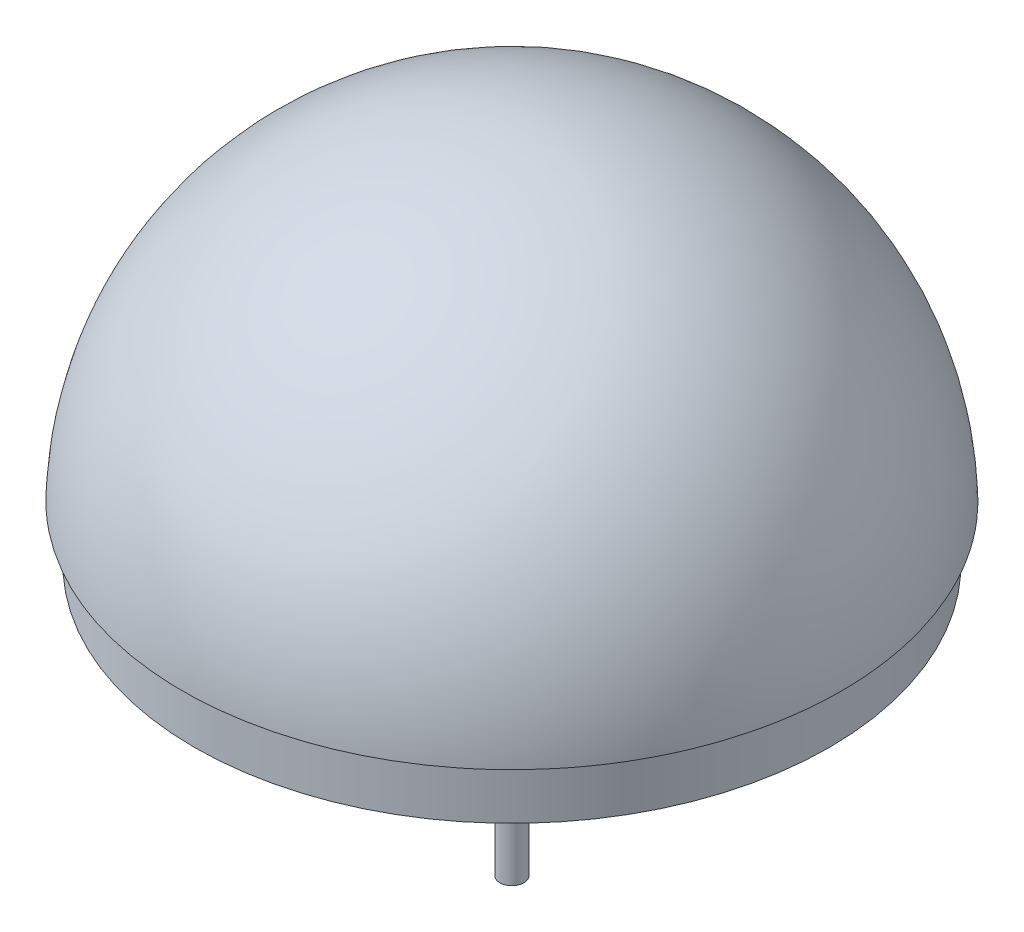
ISO-10303-21;
HEADER;
FILE_DESCRIPTION(('STEP AP214'),'2;1');
FILE_NAME('part.step','',(''),(''),'','','');
FILE_SCHEMA(('AUTOMOTIVE_DESIGN { 1 0 10303 214 1 1 1 1 }'));
ENDSEC;
DATA;
#1=APPLICATION_CONTEXT('core data for automotive mechanical design processes');
#2=APPLICATION_PROTOCOL_DEFINITION('international standard','automotive_design',2000,#1);
#3=PRODUCT_CONTEXT('',#1,'mechanical');
#4=PRODUCT('Part','Part','',(#3));
#5=PRODUCT_RELATED_PRODUCT_CATEGORY('part','',(#4));
#6=PRODUCT_DEFINITION_FORMATION('','',#4);
#7=PRODUCT_DEFINITION_CONTEXT('part definition',#1,'design');
#8=PRODUCT_DEFINITION('design','',#6,#7);
#9=PRODUCT_DEFINITION_SHAPE('','',#8);
#10=(LENGTH_UNIT() NAMED_UNIT(*) SI_UNIT(.MILLI.,.METRE.));
#11=(NAMED_UNIT(*) PLANE_ANGLE_UNIT() SI_UNIT($,.RADIAN.));
#12=(NAMED_UNIT(*) SI_UNIT($,.STERADIAN.) SOLID_ANGLE_UNIT());
#13=UNCERTAINTY_MEASURE_WITH_UNIT(LENGTH_MEASURE(1.E-05),#10,'distance_accuracy_value','');
#14=(GEOMETRIC_REPRESENTATION_CONTEXT(3) GLOBAL_UNCERTAINTY_ASSIGNED_CONTEXT((#13)) GLOBAL_UNIT_ASSIGNED_CONTEXT((#10,
#11,#12)) REPRESENTATION_CONTEXT('',''));
#15=CARTESIAN_POINT('',(0.,0.,0.));
#16=DIRECTION('',(0.,0.,1.));
#17=DIRECTION('',(1.,0.,0.));
#18=AXIS2_PLACEMENT_3D('',#15,#16,#17);
#19=CARTESIAN_POINT('',(0.,0.,0.));
#20=DIRECTION('',(-1.,0.,0.));
#21=DIRECTION('',(0.,1.,0.));
#22=AXIS2_PLACEMENT_3D('',#19,#20,#21);
#23=SPHERICAL_SURFACE('',#22,39.0404692850893);
#24=CARTESIAN_POINT('',(0.,-39.011696195372,0.));
#25=DIRECTION('',(0.,-1.,0.));
#26=DIRECTION('',(0.,0.,-1.));
#27=AXIS2_PLACEMENT_3D('',#24,#25,#26);
#28=CIRCLE('',#27,1.49860000000001);
#29=CARTESIAN_POINT('',(0.,-39.011696195372,-1.49860000000001));
#30=VERTEX_POINT('',#29);
#31=EDGE_CURVE('E19',#30,#30,#28,.F.);
#32=ORIENTED_EDGE('',*,*,#31,.F.);
#33=EDGE_LOOP('',(#32));
#34=FACE_BOUND('',#33,.T.);
#35=ADVANCED_FACE('F15',(#34),#23,.T.);
#36=CARTESIAN_POINT('',(0.,0.,0.));
#37=DIRECTION('',(0.,-1.,0.));
#38=DIRECTION('',(0.,0.,-1.));
#39=AXIS2_PLACEMENT_3D('',#36,#37,#38);
#40=CYLINDRICAL_SURFACE('',#39,1.49860000000001);
#41=CARTESIAN_POINT('',(0.,39.011696195372,0.));
#42=DIRECTION('',(0.,-1.,0.));
#43=DIRECTION('',(0.,0.,-1.));
#44=AXIS2_PLACEMENT_3D('',#41,#42,#43);
#45=CIRCLE('',#44,1.49860000000001);
#46=CARTESIAN_POINT('',(0.,39.011696195372,-1.49860000000001));
#47=VERTEX_POINT('',#46);
#48=EDGE_CURVE('E64',#47,#47,#45,.T.);
#49=ORIENTED_EDGE('',*,*,#48,.T.);
#50=EDGE_LOOP('',(#49));
#51=FACE_BOUND('',#50,.T.);
#52=ORIENTED_EDGE('',*,*,#31,.T.);
#53=EDGE_LOOP('',(#52));
#54=FACE_BOUND('',#53,.T.);
#55=ADVANCED_FACE('F51',(#51,#54),#40,.T.);
#56=CARTESIAN_POINT('',(0.,0.,0.));
#57=DIRECTION('',(1.,0.,0.));
#58=DIRECTION('',(0.,1.,0.));
#59=AXIS2_PLACEMENT_3D('',#56,#57,#58);
#60=SPHERICAL_SURFACE('',#59,39.0404692850893);
#61=ORIENTED_EDGE('',*,*,#48,.F.);
#62=EDGE_LOOP('',(#61));
#63=FACE_BOUND('',#62,.T.);
#64=CARTESIAN_POINT('',(0.,11.1506,0.));
#65=DIRECTION('',(0.,-1.,0.));
#66=DIRECTION('',(0.,0.,-1.));
#67=AXIS2_PLACEMENT_3D('',#64,#65,#66);
#68=CIRCLE('',#67,37.4142);
#69=CARTESIAN_POINT('',(0.,11.1506,-37.4142));
#70=VERTEX_POINT('',#69);
#71=EDGE_CURVE('E67',#70,#70,#68,.T.);
#72=ORIENTED_EDGE('',*,*,#71,.T.);
#73=EDGE_LOOP('',(#72));
#74=FACE_BOUND('',#73,.T.);
#75=ADVANCED_FACE('F47',(#63,#74),#60,.F.);
#76=CARTESIAN_POINT('',(0.,0.,0.));
#77=DIRECTION('',(0.,-1.,0.));
#78=DIRECTION('',(0.,0.,-1.));
#79=AXIS2_PLACEMENT_3D('',#76,#77,#78);
#80=CYLINDRICAL_SURFACE('',#79,37.4142);
#81=ORIENTED_EDGE('',*,*,#71,.F.);
#82=EDGE_LOOP('',(#81));
#83=FACE_BOUND('',#82,.T.);
#84=CARTESIAN_POINT('',(0.,-5.53720000000001,0.));
#85=DIRECTION('',(0.,-1.,0.));
#86=DIRECTION('',(0.,0.,-1.));
#87=AXIS2_PLACEMENT_3D('',#84,#85,#86);
#88=CIRCLE('',#87,37.4142);
#89=CARTESIAN_POINT('',(0.,-5.53720000000001,-37.4142));
#90=VERTEX_POINT('',#89);
#91=EDGE_CURVE('E69',#90,#90,#88,.T.);
#92=ORIENTED_EDGE('',*,*,#91,.T.);
#93=EDGE_LOOP('',(#92));
#94=FACE_BOUND('',#93,.T.);
#95=ADVANCED_FACE('F50',(#83,#94),#80,.F.);
#96=CARTESIAN_POINT('',(0.,-5.53720000000001,0.));
#97=DIRECTION('',(0.,1.,0.));
#98=DIRECTION('',(0.,0.,1.));
#99=AXIS2_PLACEMENT_3D('',#96,#97,#98);
#100=PLANE('',#99);
#101=CARTESIAN_POINT('',(0.,-5.53720000000001,0.));
#102=DIRECTION('',(0.,-1.,0.));
#103=DIRECTION('',(0.,0.,-1.));
#104=AXIS2_PLACEMENT_3D('',#101,#102,#103);
#105=CIRCLE('',#104,39.37);
#106=CARTESIAN_POINT('',(0.,-5.53720000000001,-39.37));
#107=VERTEX_POINT('',#106);
#108=EDGE_CURVE('E28',#107,#107,#105,.F.);
#109=ORIENTED_EDGE('',*,*,#108,.F.);
#110=EDGE_LOOP('',(#109));
#111=FACE_BOUND('',#110,.T.);
#112=ORIENTED_EDGE('',*,*,#91,.F.);
#113=EDGE_LOOP('',(#112));
#114=FACE_BOUND('',#113,.T.);
#115=ADVANCED_FACE('F79',(#111,#114),#100,.F.);
#116=CARTESIAN_POINT('',(0.,0.,0.));
#117=DIRECTION('',(0.,-1.,0.));
#118=DIRECTION('',(0.,0.,-1.));
#119=AXIS2_PLACEMENT_3D('',#116,#117,#118);
#120=CYLINDRICAL_SURFACE('',#119,39.37);
#121=ORIENTED_EDGE('',*,*,#108,.T.);
#122=EDGE_LOOP('',(#121));
#123=FACE_BOUND('',#122,.T.);
#124=CARTESIAN_POINT('',(0.,1.26999999999999,0.));
#125=DIRECTION('',(0.,-1.,0.));
#126=DIRECTION('',(0.,0.,-1.));
#127=AXIS2_PLACEMENT_3D('',#124,#125,#126);
#128=CIRCLE('',#127,39.37);
#129=CARTESIAN_POINT('',(0.,1.26999999999999,-39.37));
#130=VERTEX_POINT('',#129);
#131=EDGE_CURVE('E23',#130,#130,#128,.T.);
#132=ORIENTED_EDGE('',*,*,#131,.T.);
#133=EDGE_LOOP('',(#132));
#134=FACE_BOUND('',#133,.T.);
#135=ADVANCED_FACE('F76',(#123,#134),#120,.T.);
#136=CARTESIAN_POINT('',(0.,1.26999999999999,0.));
#137=DIRECTION('',(0.,1.,0.));
#138=DIRECTION('',(0.,0.,1.));
#139=AXIS2_PLACEMENT_3D('',#136,#137,#138);
#140=PLANE('',#139);
#141=CARTESIAN_POINT('',(40.8559,1.26999999999999,0.));
#142=CARTESIAN_POINT('',(40.8559023465588,1.26999999999999,-0.84737316406443));
#143=CARTESIAN_POINT('',(40.8295313838267,1.27,-1.69470400813748));
#144=CARTESIAN_POINT('',(40.7236790465876,1.27,-3.39373231866732));
#145=CARTESIAN_POINT('',(40.6437213594324,1.26999999999999,-4.24540035676923));
#146=CARTESIAN_POINT('',(40.4305121557793,1.26999999999999,-5.94218616830133));
#147=CARTESIAN_POINT('',(40.2972509463117,1.26999999999999,-6.78730272186968));
#148=CARTESIAN_POINT('',(39.9777056834069,1.26999999999999,-8.46883043421178));
#149=CARTESIAN_POINT('',(39.7913393475322,1.26999999999999,-9.3052259793681));
#150=CARTESIAN_POINT('',(39.3664100983211,1.27,-10.9646768803048));
#151=CARTESIAN_POINT('',(39.1278429340135,1.27,-11.7877311437724));
#152=CARTESIAN_POINT('',(38.5094290106909,1.27000000000001,-13.6947537314464));
#153=CARTESIAN_POINT('',(38.1091344701599,1.27,-14.7721610467279));
#154=CARTESIAN_POINT('',(37.2191650839238,1.26999999999999,-16.8895752560325));
#155=CARTESIAN_POINT('',(36.7294720819156,1.26999999999999,-17.9295745012431));
#156=CARTESIAN_POINT('',(35.6640460391866,1.27,-19.9649738317511));
#157=CARTESIAN_POINT('',(35.0882855551751,1.27,-20.960359559613));
#158=CARTESIAN_POINT('',(33.8549732117105,1.26999999999999,-22.8990217611628));
#159=CARTESIAN_POINT('',(33.197425537432,1.26999999999998,-23.8423008976601));
#160=CARTESIAN_POINT('',(31.8052849787617,1.26999999999998,-25.6699792438987));
#161=CARTESIAN_POINT('',(31.0707025798076,1.26999999999999,-26.5543864401641));
#162=CARTESIAN_POINT('',(29.5296326002137,1.27,-28.2581817838248));
#163=CARTESIAN_POINT('',(28.7231441356675,1.26999999999999,-29.0775691317285));
#164=CARTESIAN_POINT('',(27.0440790436735,1.26999999999999,-30.6454170471412));
#165=CARTESIAN_POINT('',(26.1715083340082,1.27,-31.3938839522202));
#166=CARTESIAN_POINT('',(24.3664210406273,1.26999999999999,-32.8146509459099));
#167=CARTESIAN_POINT('',(23.4339046328961,1.26999999999997,-33.4869512581094));
#168=CARTESIAN_POINT('',(21.5155174997816,1.26999999999997,-34.7506315623577));
#169=CARTESIAN_POINT('',(20.5296448197638,1.26999999999999,-35.3420085870879));
#170=CARTESIAN_POINT('',(18.5115845990684,1.27,-36.4396092875891));
#171=CARTESIAN_POINT('',(17.479397026177,1.26999999999999,-36.9458329041311));
#172=CARTESIAN_POINT('',(15.3760316578382,1.26999999999999,-37.8695336006089));
#173=CARTESIAN_POINT('',(14.3048533394187,1.27,-38.2870094896815));
#174=CARTESIAN_POINT('',(12.1311352526526,1.26999999999999,-39.0302380453925));
#175=CARTESIAN_POINT('',(11.0285954885883,1.26999999999997,-39.3559907245553));
#176=CARTESIAN_POINT('',(8.80000013632962,1.26999999999997,-39.9134551848463));
#177=CARTESIAN_POINT('',(7.6739447013531,1.26999999999999,-40.1451675784991));
#178=CARTESIAN_POINT('',(5.40631661047983,1.27,-40.5129071769413));
#179=CARTESIAN_POINT('',(4.26474395429726,1.26999999999999,-40.6489343799682));
#180=CARTESIAN_POINT('',(1.97419798632233,1.26999999999999,-40.8243364682638));
#181=CARTESIAN_POINT('',(0.825224678662399,1.27,-40.8637114074969));
#182=CARTESIAN_POINT('',(-1.47195471274426,1.26999999999999,-40.8455291929581));
#183=CARTESIAN_POINT('',(-2.62016079649509,1.26999999999998,-40.7879720397045));
#184=CARTESIAN_POINT('',(-4.90763842774139,1.26999999999998,-40.5763352336916));
#185=CARTESIAN_POINT('',(-6.04691000849922,1.26999999999999,-40.4222559404484));
#186=CARTESIAN_POINT('',(-8.30842349916943,1.27,-40.0186705778584));
#187=CARTESIAN_POINT('',(-9.43066540897119,1.27,-39.7691645078918));
#188=CARTESIAN_POINT('',(-11.6501500401366,1.26999999999999,-39.1764970527501));
#189=CARTESIAN_POINT('',(-12.7473925611023,1.26999999999999,-38.8333349171034));
#190=CARTESIAN_POINT('',(-14.909068306437,1.27,-38.0557958591142));
#191=CARTESIAN_POINT('',(-15.9735015318888,1.27000000000001,-37.6214189397821));
#192=CARTESIAN_POINT('',(-18.0620229219748,1.27000000000001,-36.6645241072833));
#193=CARTESIAN_POINT('',(-19.0861098547982,1.27,-36.1420035055741));
#194=CARTESIAN_POINT('',(-21.08662409033,1.26999999999999,-35.0125445332826));
#195=CARTESIAN_POINT('',(-22.0630513764233,1.26999999999999,-34.4056061332708));
#196=CARTESIAN_POINT('',(-23.961236323884,1.27,-33.1116746245766));
#197=CARTESIAN_POINT('',(-24.8829977312093,1.27,-32.4246870108219));
#198=CARTESIAN_POINT('',(-26.6653772490902,1.26999999999999,-30.9754967123405));
#199=CARTESIAN_POINT('',(-27.5259954695212,1.26999999999998,-30.2132941627823));
#200=CARTESIAN_POINT('',(-29.1798147652513,1.26999999999998,-28.6192592819154));
#201=CARTESIAN_POINT('',(-29.9730262442194,1.26999999999999,-27.7874377351993));
#202=CARTESIAN_POINT('',(-31.4866594951565,1.27,-26.0598025659561));
#203=CARTESIAN_POINT('',(-32.2070807567475,1.26999999999999,-25.1639884948124));
#204=CARTESIAN_POINT('',(-33.2291848210569,1.26999999999999,-23.7772204811257));
#205=CARTESIAN_POINT('',(-33.5602280507942,1.26999999999999,-23.3076328999806));
#206=CARTESIAN_POINT('',(-34.2022211666933,1.26999999999999,-22.3549199776751));
#207=CARTESIAN_POINT('',(-34.5131724070078,1.26999999999999,-21.8717955520192));
#208=CARTESIAN_POINT('',(-35.1143865410316,1.26999999999999,-20.8929246526152));
#209=CARTESIAN_POINT('',(-35.4046519906589,1.26999999999999,-20.3971797485515));
#210=CARTESIAN_POINT('',(-35.9640849366327,1.26999999999999,-19.3937947144173));
#211=CARTESIAN_POINT('',(-36.2332469593968,1.26999999999999,-18.8861515423576));
#212=CARTESIAN_POINT('',(-37.00849572868,1.26999999999999,-17.3463663895778));
#213=CARTESIAN_POINT('',(-37.4821575145943,1.26999999999999,-16.2976743803313));
#214=CARTESIAN_POINT('',(-38.3393389660795,1.26999999999999,-14.164087398525));
#215=CARTESIAN_POINT('',(-38.7228595756395,1.26999999999999,-13.0791928052268));
#216=CARTESIAN_POINT('',(-39.228247343394,1.26999999999999,-11.4314916128311));
#217=CARTESIAN_POINT('',(-39.384994437335,1.26999999999999,-10.8791722058124));
#218=CARTESIAN_POINT('',(-39.6750559500304,1.26999999999999,-9.76850785883151));
#219=CARTESIAN_POINT('',(-39.8083755618591,1.26999999999999,-9.21016428342149));
#220=CARTESIAN_POINT('',(-40.0513314580128,1.26999999999999,-8.08854821049555));
#221=CARTESIAN_POINT('',(-40.1609753669247,1.26999999999999,-7.52527736075815));
#222=CARTESIAN_POINT('',(-40.3564401418004,1.26999999999999,-6.39463855273095));
#223=CARTESIAN_POINT('',(-40.4422622915637,1.27,-5.82727081692148));
#224=CARTESIAN_POINT('',(-40.5726859931858,1.27,-4.82234737578311));
#225=CARTESIAN_POINT('',(-40.6222334473209,1.26999999999999,-4.38542777400298));
#226=CARTESIAN_POINT('',(-40.7071936220205,1.26999999999999,-3.51030219897586));
#227=CARTESIAN_POINT('',(-40.7426086838053,1.26999999999999,-3.07209645092304));
#228=CARTESIAN_POINT('',(-40.8275536631145,1.27,-1.75689104700758));
#229=CARTESIAN_POINT('',(-40.8558975674582,1.27000000000001,-0.878422784399849));
#230=CARTESIAN_POINT('',(-40.8559023465588,1.27000000000001,0.847373164064436));
#231=CARTESIAN_POINT('',(-40.8295313838267,1.27,1.69470400813749));
#232=CARTESIAN_POINT('',(-40.7236790465876,1.26999999999999,3.39373231866733));
#233=CARTESIAN_POINT('',(-40.6437213594324,1.26999999999999,4.24540035676925));
#234=CARTESIAN_POINT('',(-40.4305121557793,1.26999999999999,5.94218616830135));
#235=CARTESIAN_POINT('',(-40.2972509463117,1.26999999999999,6.7873027218697));
#236=CARTESIAN_POINT('',(-39.9777056834069,1.26999999999999,8.46883043421181));
#237=CARTESIAN_POINT('',(-39.7913393475322,1.26999999999999,9.30522597936813));
#238=CARTESIAN_POINT('',(-39.3664100983211,1.26999999999999,10.9646768803049));
#239=CARTESIAN_POINT('',(-39.1278429340135,1.26999999999999,11.7877311437724));
#240=CARTESIAN_POINT('',(-38.5094290106909,1.26999999999999,13.6947537314464));
#241=CARTESIAN_POINT('',(-38.1091344701599,1.26999999999999,14.7721610467279));
#242=CARTESIAN_POINT('',(-37.2191650839238,1.26999999999999,16.8895752560325));
#243=CARTESIAN_POINT('',(-36.7294720819156,1.26999999999999,17.9295745012431));
#244=CARTESIAN_POINT('',(-35.6640460391866,1.26999999999999,19.9649738317512));
#245=CARTESIAN_POINT('',(-35.0882855551751,1.27,20.960359559613));
#246=CARTESIAN_POINT('',(-33.8549732117105,1.26999999999999,22.8990217611629));
#247=CARTESIAN_POINT('',(-33.197425537432,1.26999999999999,23.8423008976601));
#248=CARTESIAN_POINT('',(-31.8052849787617,1.26999999999999,25.6699792438988));
#249=CARTESIAN_POINT('',(-31.0707025798075,1.26999999999999,26.5543864401641));
#250=CARTESIAN_POINT('',(-29.5296326002136,1.27,28.2581817838248));
#251=CARTESIAN_POINT('',(-28.7231441356674,1.26999999999999,29.0775691317286));
#252=CARTESIAN_POINT('',(-27.0440790436735,1.26999999999999,30.6454170471412));
#253=CARTESIAN_POINT('',(-26.1715083340082,1.26999999999999,31.3938839522202));
#254=CARTESIAN_POINT('',(-24.3664210406272,1.26999999999999,32.8146509459099));
#255=CARTESIAN_POINT('',(-23.4339046328961,1.26999999999999,33.4869512581094));
#256=CARTESIAN_POINT('',(-21.5155174997815,1.26999999999999,34.7506315623577));
#257=CARTESIAN_POINT('',(-20.5296448197637,1.26999999999999,35.3420085870879));
#258=CARTESIAN_POINT('',(-18.5115845990684,1.26999999999999,36.4396092875891));
#259=CARTESIAN_POINT('',(-17.4793970261769,1.26999999999999,36.9458329041311));
#260=CARTESIAN_POINT('',(-15.3760316578382,1.26999999999999,37.8695336006089));
#261=CARTESIAN_POINT('',(-14.3048533394187,1.26999999999999,38.2870094896816));
#262=CARTESIAN_POINT('',(-12.1311352526525,1.27,39.0302380453925));
#263=CARTESIAN_POINT('',(-11.0285954885882,1.27000000000001,39.3559907245553));
#264=CARTESIAN_POINT('',(-8.80000013632957,1.27000000000001,39.9134551848463));
#265=CARTESIAN_POINT('',(-7.67394470135305,1.27,40.1451675784991));
#266=CARTESIAN_POINT('',(-5.40631661047978,1.26999999999999,40.5129071769413));
#267=CARTESIAN_POINT('',(-4.26474395429721,1.26999999999999,40.6489343799682));
#268=CARTESIAN_POINT('',(-1.97419798632228,1.26999999999999,40.8243364682638));
#269=CARTESIAN_POINT('',(-0.825224678662349,1.26999999999999,40.8637114074969));
#270=CARTESIAN_POINT('',(1.47195471274431,1.27,40.8455291929581));
#271=CARTESIAN_POINT('',(2.62016079649514,1.27000000000001,40.7879720397045));
#272=CARTESIAN_POINT('',(4.90763842774144,1.27000000000001,40.5763352336915));
#273=CARTESIAN_POINT('',(6.04691000849927,1.27,40.4222559404484));
#274=CARTESIAN_POINT('',(8.30842349916948,1.26999999999999,40.0186705778584));
#275=CARTESIAN_POINT('',(9.43066540897123,1.26999999999999,39.7691645078917));
#276=CARTESIAN_POINT('',(11.6501500401367,1.26999999999999,39.1764970527501));
#277=CARTESIAN_POINT('',(12.7473925611024,1.26999999999999,38.8333349171034));
#278=CARTESIAN_POINT('',(14.909068306437,1.26999999999999,38.0557958591142));
#279=CARTESIAN_POINT('',(15.9735015318888,1.26999999999999,37.6214189397821));
#280=CARTESIAN_POINT('',(18.0620229219749,1.26999999999999,36.6645241072832));
#281=CARTESIAN_POINT('',(19.0861098547982,1.26999999999999,36.1420035055741));
#282=CARTESIAN_POINT('',(21.0866240903301,1.26999999999999,35.0125445332826));
#283=CARTESIAN_POINT('',(22.0630513764234,1.26999999999999,34.4056061332707));
#284=CARTESIAN_POINT('',(23.9612363238841,1.26999999999999,33.1116746245766));
#285=CARTESIAN_POINT('',(24.8829977312094,1.26999999999999,32.4246870108219));
#286=CARTESIAN_POINT('',(26.6653772490902,1.26999999999999,30.9754967123405));
#287=CARTESIAN_POINT('',(27.5259954695213,1.26999999999999,30.2132941627822));
#288=CARTESIAN_POINT('',(29.1798147652514,1.26999999999999,28.6192592819153));
#289=CARTESIAN_POINT('',(29.9730262442194,1.26999999999999,27.7874377351992));
#290=CARTESIAN_POINT('',(31.4866594951565,1.26999999999999,26.0598025659561));
#291=CARTESIAN_POINT('',(32.2070807567476,1.26999999999999,25.1639884948124));
#292=CARTESIAN_POINT('',(33.2291848210569,1.26999999999999,23.7772204811256));
#293=CARTESIAN_POINT('',(33.5602280507943,1.26999999999999,23.3076328999806));
#294=CARTESIAN_POINT('',(34.2022211666933,1.26999999999999,22.3549199776751));
#295=CARTESIAN_POINT('',(34.5131724070078,1.26999999999999,21.8717955520191));
#296=CARTESIAN_POINT('',(35.1143865410316,1.26999999999999,20.8929246526152));
#297=CARTESIAN_POINT('',(35.404651990659,1.26999999999999,20.3971797485515));
#298=CARTESIAN_POINT('',(35.9640849366327,1.26999999999999,19.3937947144173));
#299=CARTESIAN_POINT('',(36.2332469593968,1.26999999999999,18.8861515423575));
#300=CARTESIAN_POINT('',(37.00849572868,1.26999999999999,17.3463663895778));
#301=CARTESIAN_POINT('',(37.4821575145943,1.26999999999999,16.2976743803313));
#302=CARTESIAN_POINT('',(38.3393389660796,1.26999999999999,14.1640873985249));
#303=CARTESIAN_POINT('',(38.7228595756395,1.26999999999999,13.0791928052268));
#304=CARTESIAN_POINT('',(39.228247343394,1.26999999999999,11.431491612831));
#305=CARTESIAN_POINT('',(39.384994437335,1.26999999999999,10.8791722058123));
#306=CARTESIAN_POINT('',(39.6750559500304,1.26999999999999,9.76850785883145));
#307=CARTESIAN_POINT('',(39.8083755618591,1.26999999999999,9.21016428342143));
#308=CARTESIAN_POINT('',(40.0513314580128,1.26999999999999,8.08854821049549));
#309=CARTESIAN_POINT('',(40.1609753669247,1.26999999999999,7.52527736075809));
#310=CARTESIAN_POINT('',(40.3564401418004,1.26999999999999,6.39463855273089));
#311=CARTESIAN_POINT('',(40.4422622915637,1.26999999999999,5.82727081692142));
#312=CARTESIAN_POINT('',(40.5726859931858,1.26999999999999,4.82234737578306));
#313=CARTESIAN_POINT('',(40.6222334473209,1.26999999999999,4.38542777400293));
#314=CARTESIAN_POINT('',(40.7071936220205,1.26999999999999,3.51030219897582));
#315=CARTESIAN_POINT('',(40.7426086838053,1.26999999999999,3.07209645092301));
#316=CARTESIAN_POINT('',(40.8275536631145,1.26999999999999,1.75689104700756));
#317=CARTESIAN_POINT('',(40.8558975674582,1.26999999999999,0.878422784399842));
#318=CARTESIAN_POINT('',(40.8559,1.26999999999999,0.));
#319=B_SPLINE_CURVE_WITH_KNOTS('',3,(#141,#142,#143,#144,#145,#146,#147,#148,#149,#150,#151,
#152,#153,#154,#155,#156,#157,#158,#159,#160,#161,#162,#163,#164,#165,#166,#167,#168,#169,#170,
#171,#172,#173,#174,#175,#176,#177,#178,#179,#180,#181,#182,#183,#184,#185,#186,#187,#188,#189,
#190,#191,#192,#193,#194,#195,#196,#197,#198,#199,#200,#201,#202,#203,#204,#205,#206,#207,#208,
#209,#210,#211,#212,#213,#214,#215,#216,#217,#218,#219,#220,#221,#222,#223,#224,#225,#226,#227,
#228,#229,#230,#231,#232,#233,#234,#235,#236,#237,#238,#239,#240,#241,#242,#243,#244,#245,#246,
#247,#248,#249,#250,#251,#252,#253,#254,#255,#256,#257,#258,#259,#260,#261,#262,#263,#264,#265,
#266,#267,#268,#269,#270,#271,#272,#273,#274,#275,#276,#277,#278,#279,#280,#281,#282,#283,#284,
#285,#286,#287,#288,#289,#290,#291,#292,#293,#294,#295,#296,#297,#298,#299,#300,#301,#302,#303,
#304,#305,#306,#307,#308,#309,#310,#311,#312,#313,#314,#315,#316,#317,#318),.UNSPECIFIED.,.T.,
.F.,(4,2,2,2,2,2,2,2,2,2,2,2,2,2,2,2,2,2,2,2,2,2,2,2,2,2,2,2,2,2,2,2,2,2,2,2,2,2,2,2,2,2,2,2,2,
2,2,2,2,2,2,2,2,2,2,2,2,2,2,2,2,2,2,2,2,2,2,2,2,2,2,2,2,2,2,2,2,2,2,2,2,2,2,2,2,2,2,2,4),(0.,
2.54163867179328,5.10617406198381,7.67117601182738,10.2401740552859,12.8093813828491,
16.2532076303525,19.6977340784295,23.1433611927837,26.5888120616493,30.0337945666082,
33.478819424911,36.923536139093,40.3682427409717,43.8130756205212,47.2579108961351,
50.7027923934212,54.1476734203168,57.5925320088678,61.03739066087,64.4822473894779,
67.9271040996622,71.3719479788605,74.816791880437,78.2616633865682,81.7065347790071,
85.151511265286,88.5964889525486,92.0412303006547,95.4859654583389,98.9301679805505,
102.374394650557,104.097610689849,105.820710467027,107.543596969054,109.266928866859,
112.714665072279,116.162365170223,117.884333233255,119.605919111839,121.326949736686,
123.047887593941,124.366820391037,125.685534598448,128.320304512928,130.861943184721,
133.426478574912,135.991480524755,138.560478568214,141.129685895777,144.57351214328,
148.018038591357,151.463665705712,154.909116574577,158.354099079536,161.799123937839,
165.243840652021,168.6885472539,172.133380133449,175.578215409063,179.023096906349,
182.467977933245,185.912836521796,189.357695173798,192.802551902406,196.24740861259,
199.692252491788,203.137096393365,206.581967899496,210.026839291935,213.471815778214,
216.916793465477,220.361534813583,223.806269971267,227.250472493478,230.694699163485,
232.417915202777,234.141014979955,235.863901481982,237.587233379787,241.034969585207,
244.482669683151,246.204637746182,247.926223624767,249.647254249614,251.368192106869,
252.687124903965,254.005839111375,256.640609025856),.UNSPECIFIED.);
#320=CARTESIAN_POINT('',(40.8559,1.26999999999999,0.));
#321=VERTEX_POINT('',#320);
#322=EDGE_CURVE('E10',#321,#321,#319,.T.);
#323=ORIENTED_EDGE('',*,*,#322,.F.);
#324=EDGE_LOOP('',(#323));
#325=FACE_BOUND('',#324,.T.);
#326=ORIENTED_EDGE('',*,*,#131,.F.);
#327=EDGE_LOOP('',(#326));
#328=FACE_BOUND('',#327,.T.);
#329=ADVANCED_FACE('F37',(#325,#328),#140,.F.);
#330=CARTESIAN_POINT('',(0.,0.,0.));
#331=DIRECTION('',(1.,0.,0.));
#332=DIRECTION('',(0.,1.,0.));
#333=AXIS2_PLACEMENT_3D('',#330,#331,#332);
#334=SPHERICAL_SURFACE('',#333,40.8756341211974);
#335=ORIENTED_EDGE('',*,*,#322,.T.);
#336=EDGE_LOOP('',(#335));
#337=FACE_BOUND('',#336,.T.);
#338=ADVANCED_FACE('F40',(#337),#334,.T.);
#339=CLOSED_SHELL('',(#35,#55,#75,#95,#115,#135,#329,#338));
#340=MANIFOLD_SOLID_BREP('B1',#339);
#341=ADVANCED_BREP_SHAPE_REPRESENTATION('',(#18,#340),#14);
#342=SHAPE_DEFINITION_REPRESENTATION(#9,#341);
ENDSEC;
END-ISO-10303-21;
